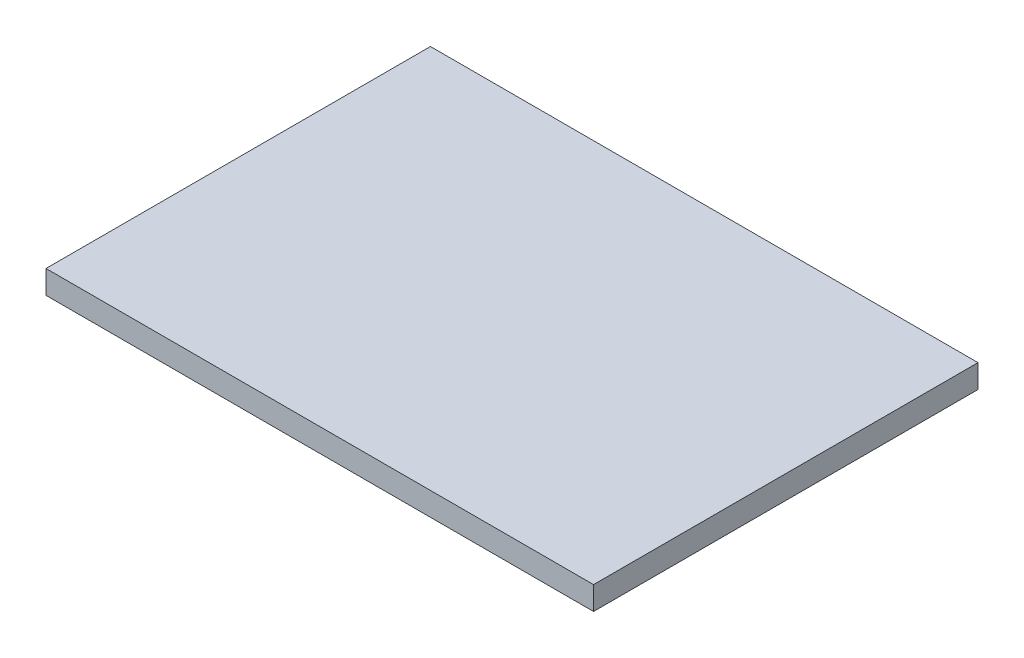
ISO-10303-21;
HEADER;
FILE_DESCRIPTION(('STEP AP214'),'2;1');
FILE_NAME('part.step','',(''),(''),'','','');
FILE_SCHEMA(('AUTOMOTIVE_DESIGN { 1 0 10303 214 1 1 1 1 }'));
ENDSEC;
DATA;
#1=APPLICATION_CONTEXT('core data for automotive mechanical design processes');
#2=APPLICATION_PROTOCOL_DEFINITION('international standard','automotive_design',2000,#1);
#3=PRODUCT_CONTEXT('',#1,'mechanical');
#4=PRODUCT('Part','Part','',(#3));
#5=PRODUCT_RELATED_PRODUCT_CATEGORY('part','',(#4));
#6=PRODUCT_DEFINITION_FORMATION('','',#4);
#7=PRODUCT_DEFINITION_CONTEXT('part definition',#1,'design');
#8=PRODUCT_DEFINITION('design','',#6,#7);
#9=PRODUCT_DEFINITION_SHAPE('','',#8);
#10=(LENGTH_UNIT() NAMED_UNIT(*) SI_UNIT(.MILLI.,.METRE.));
#11=(NAMED_UNIT(*) PLANE_ANGLE_UNIT() SI_UNIT($,.RADIAN.));
#12=(NAMED_UNIT(*) SI_UNIT($,.STERADIAN.) SOLID_ANGLE_UNIT());
#13=UNCERTAINTY_MEASURE_WITH_UNIT(LENGTH_MEASURE(1.E-05),#10,'distance_accuracy_value','');
#14=(GEOMETRIC_REPRESENTATION_CONTEXT(3) GLOBAL_UNCERTAINTY_ASSIGNED_CONTEXT((#13)) GLOBAL_UNIT_ASSIGNED_CONTEXT((#10,
#11,#12)) REPRESENTATION_CONTEXT('',''));
#15=CARTESIAN_POINT('',(0.,0.,0.));
#16=DIRECTION('',(0.,0.,1.));
#17=DIRECTION('',(1.,0.,0.));
#18=AXIS2_PLACEMENT_3D('',#15,#16,#17);
#19=CARTESIAN_POINT('',(47.,4.,-33.));
#20=DIRECTION('',(-1.,0.,0.));
#21=DIRECTION('',(0.,0.,1.));
#22=AXIS2_PLACEMENT_3D('',#19,#20,#21);
#23=PLANE('',#22);
#24=DIRECTION('',(0.,0.,-1.));
#25=VECTOR('',#24,1.);
#26=CARTESIAN_POINT('',(47.,0.,-33.));
#27=LINE('',#26,#25);
#28=CARTESIAN_POINT('',(47.,0.,33.));
#29=VERTEX_POINT('',#28);
#30=CARTESIAN_POINT('',(47.,0.,-33.));
#31=VERTEX_POINT('',#30);
#32=EDGE_CURVE('E111',#29,#31,#27,.T.);
#33=ORIENTED_EDGE('',*,*,#32,.T.);
#34=DIRECTION('',(0.,-1.,0.));
#35=VECTOR('',#34,1.);
#36=CARTESIAN_POINT('',(47.,4.,-33.));
#37=LINE('',#36,#35);
#38=CARTESIAN_POINT('',(47.,4.,-33.));
#39=VERTEX_POINT('',#38);
#40=EDGE_CURVE('E11',#39,#31,#37,.T.);
#41=ORIENTED_EDGE('',*,*,#40,.F.);
#42=DIRECTION('',(0.,0.,-1.));
#43=VECTOR('',#42,1.);
#44=CARTESIAN_POINT('',(47.,4.,-33.));
#45=LINE('',#44,#43);
#46=CARTESIAN_POINT('',(47.,4.,33.));
#47=VERTEX_POINT('',#46);
#48=EDGE_CURVE('E95',#47,#39,#45,.T.);
#49=ORIENTED_EDGE('',*,*,#48,.F.);
#50=DIRECTION('',(0.,-1.,0.));
#51=VECTOR('',#50,1.);
#52=CARTESIAN_POINT('',(47.,4.,33.));
#53=LINE('',#52,#51);
#54=EDGE_CURVE('E107',#47,#29,#53,.T.);
#55=ORIENTED_EDGE('',*,*,#54,.T.);
#56=EDGE_LOOP('',(#33,#41,#49,#55));
#57=FACE_BOUND('',#56,.T.);
#58=ADVANCED_FACE('F43',(#57),#23,.F.);
#59=CARTESIAN_POINT('',(-47.,4.,-33.));
#60=DIRECTION('',(0.,0.,1.));
#61=DIRECTION('',(1.,0.,0.));
#62=AXIS2_PLACEMENT_3D('',#59,#60,#61);
#63=PLANE('',#62);
#64=DIRECTION('',(-1.,0.,0.));
#65=VECTOR('',#64,1.);
#66=CARTESIAN_POINT('',(-47.,0.,-33.));
#67=LINE('',#66,#65);
#68=CARTESIAN_POINT('',(-47.,0.,-33.));
#69=VERTEX_POINT('',#68);
#70=EDGE_CURVE('E100',#31,#69,#67,.T.);
#71=ORIENTED_EDGE('',*,*,#70,.T.);
#72=DIRECTION('',(0.,-1.,0.));
#73=VECTOR('',#72,1.);
#74=CARTESIAN_POINT('',(-47.,4.,-33.));
#75=LINE('',#74,#73);
#76=CARTESIAN_POINT('',(-47.,4.,-33.));
#77=VERTEX_POINT('',#76);
#78=EDGE_CURVE('E52',#77,#69,#75,.T.);
#79=ORIENTED_EDGE('',*,*,#78,.F.);
#80=DIRECTION('',(-1.,0.,0.));
#81=VECTOR('',#80,1.);
#82=CARTESIAN_POINT('',(-47.,4.,-33.));
#83=LINE('',#82,#81);
#84=EDGE_CURVE('E90',#39,#77,#83,.T.);
#85=ORIENTED_EDGE('',*,*,#84,.F.);
#86=ORIENTED_EDGE('',*,*,#40,.T.);
#87=EDGE_LOOP('',(#71,#79,#85,#86));
#88=FACE_BOUND('',#87,.T.);
#89=ADVANCED_FACE('F99',(#88),#63,.F.);
#90=CARTESIAN_POINT('',(-47.,4.,-33.));
#91=DIRECTION('',(1.,0.,0.));
#92=DIRECTION('',(0.,0.,-1.));
#93=AXIS2_PLACEMENT_3D('',#90,#91,#92);
#94=PLANE('',#93);
#95=DIRECTION('',(0.,0.,1.));
#96=VECTOR('',#95,1.);
#97=CARTESIAN_POINT('',(-47.,0.,-33.));
#98=LINE('',#97,#96);
#99=CARTESIAN_POINT('',(-47.,0.,33.));
#100=VERTEX_POINT('',#99);
#101=EDGE_CURVE('E77',#69,#100,#98,.T.);
#102=ORIENTED_EDGE('',*,*,#101,.T.);
#103=DIRECTION('',(0.,-1.,0.));
#104=VECTOR('',#103,1.);
#105=CARTESIAN_POINT('',(-47.,4.,33.));
#106=LINE('',#105,#104);
#107=CARTESIAN_POINT('',(-47.,4.,33.));
#108=VERTEX_POINT('',#107);
#109=EDGE_CURVE('E102',#108,#100,#106,.T.);
#110=ORIENTED_EDGE('',*,*,#109,.F.);
#111=DIRECTION('',(0.,0.,1.));
#112=VECTOR('',#111,1.);
#113=CARTESIAN_POINT('',(-47.,4.,-33.));
#114=LINE('',#113,#112);
#115=EDGE_CURVE('E93',#77,#108,#114,.T.);
#116=ORIENTED_EDGE('',*,*,#115,.F.);
#117=ORIENTED_EDGE('',*,*,#78,.T.);
#118=EDGE_LOOP('',(#102,#110,#116,#117));
#119=FACE_BOUND('',#118,.T.);
#120=ADVANCED_FACE('F103',(#119),#94,.F.);
#121=CARTESIAN_POINT('',(-47.,4.,33.));
#122=DIRECTION('',(0.,0.,-1.));
#123=DIRECTION('',(-1.,0.,0.));
#124=AXIS2_PLACEMENT_3D('',#121,#122,#123);
#125=PLANE('',#124);
#126=DIRECTION('',(1.,0.,0.));
#127=VECTOR('',#126,1.);
#128=CARTESIAN_POINT('',(-47.,0.,33.));
#129=LINE('',#128,#127);
#130=EDGE_CURVE('E83',#100,#29,#129,.T.);
#131=ORIENTED_EDGE('',*,*,#130,.T.);
#132=ORIENTED_EDGE('',*,*,#54,.F.);
#133=DIRECTION('',(1.,0.,0.));
#134=VECTOR('',#133,1.);
#135=CARTESIAN_POINT('',(-47.,4.,33.));
#136=LINE('',#135,#134);
#137=EDGE_CURVE('E60',#108,#47,#136,.T.);
#138=ORIENTED_EDGE('',*,*,#137,.F.);
#139=ORIENTED_EDGE('',*,*,#109,.T.);
#140=EDGE_LOOP('',(#131,#132,#138,#139));
#141=FACE_BOUND('',#140,.T.);
#142=ADVANCED_FACE('F124',(#141),#125,.F.);
#143=CARTESIAN_POINT('',(0.,4.,0.));
#144=DIRECTION('',(0.,1.,0.));
#145=DIRECTION('',(0.,0.,1.));
#146=AXIS2_PLACEMENT_3D('',#143,#144,#145);
#147=PLANE('',#146);
#148=ORIENTED_EDGE('',*,*,#48,.T.);
#149=ORIENTED_EDGE('',*,*,#84,.T.);
#150=ORIENTED_EDGE('',*,*,#115,.T.);
#151=ORIENTED_EDGE('',*,*,#137,.T.);
#152=EDGE_LOOP('',(#148,#149,#150,#151));
#153=FACE_BOUND('',#152,.T.);
#154=ADVANCED_FACE('F91',(#153),#147,.T.);
#155=CARTESIAN_POINT('',(0.,0.,0.));
#156=DIRECTION('',(0.,1.,0.));
#157=DIRECTION('',(0.,0.,1.));
#158=AXIS2_PLACEMENT_3D('',#155,#156,#157);
#159=PLANE('',#158);
#160=ORIENTED_EDGE('',*,*,#32,.F.);
#161=ORIENTED_EDGE('',*,*,#130,.F.);
#162=ORIENTED_EDGE('',*,*,#101,.F.);
#163=ORIENTED_EDGE('',*,*,#70,.F.);
#164=EDGE_LOOP('',(#160,#161,#162,#163));
#165=FACE_BOUND('',#164,.T.);
#166=ADVANCED_FACE('F127',(#165),#159,.F.);
#167=CLOSED_SHELL('',(#58,#89,#120,#142,#154,#166));
#168=MANIFOLD_SOLID_BREP('B2',#167);
#169=ADVANCED_BREP_SHAPE_REPRESENTATION('',(#18,#168),#14);
#170=SHAPE_DEFINITION_REPRESENTATION(#9,#169);
ENDSEC;
END-ISO-10303-21;
